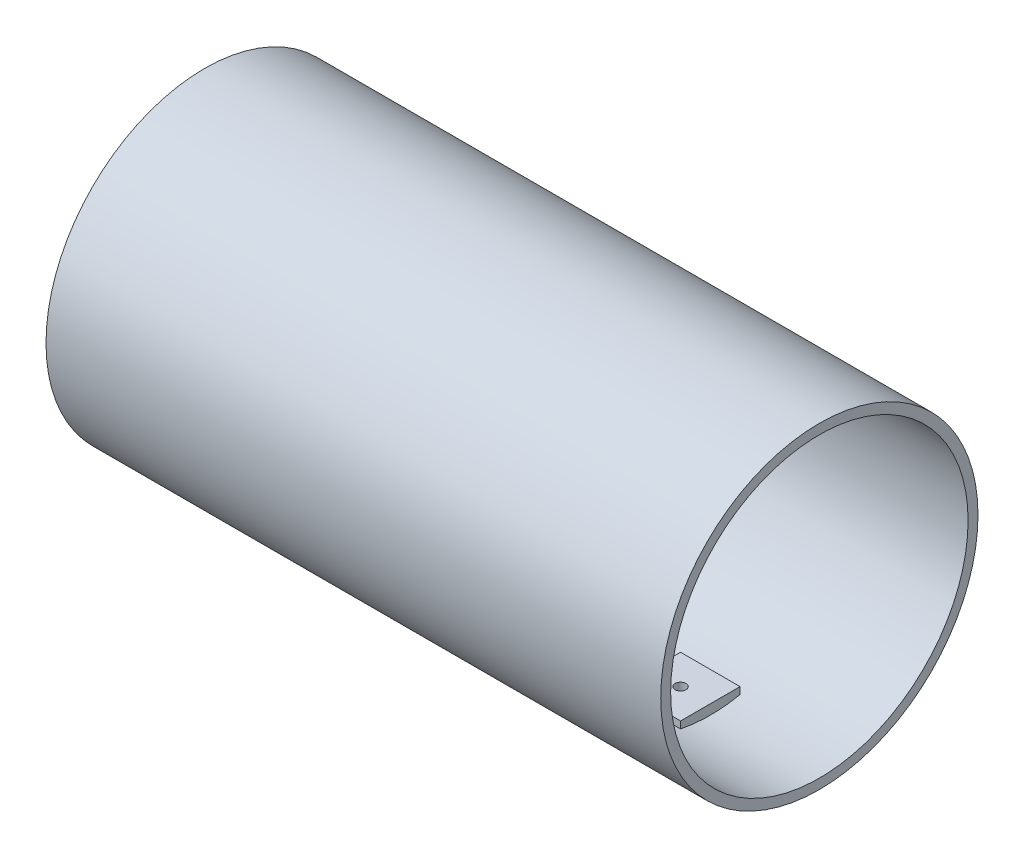
ISO-10303-21;
HEADER;
FILE_DESCRIPTION(('STEP AP214'),'2;1');
FILE_NAME('part.step','',(''),(''),'','','');
FILE_SCHEMA(('AUTOMOTIVE_DESIGN { 1 0 10303 214 1 1 1 1 }'));
ENDSEC;
DATA;
#1=APPLICATION_CONTEXT('core data for automotive mechanical design processes');
#2=APPLICATION_PROTOCOL_DEFINITION('international standard','automotive_design',2000,#1);
#3=PRODUCT_CONTEXT('',#1,'mechanical');
#4=PRODUCT('Part','Part','',(#3));
#5=PRODUCT_RELATED_PRODUCT_CATEGORY('part','',(#4));
#6=PRODUCT_DEFINITION_FORMATION('','',#4);
#7=PRODUCT_DEFINITION_CONTEXT('part definition',#1,'design');
#8=PRODUCT_DEFINITION('design','',#6,#7);
#9=PRODUCT_DEFINITION_SHAPE('','',#8);
#10=(LENGTH_UNIT() NAMED_UNIT(*) SI_UNIT(.MILLI.,.METRE.));
#11=(NAMED_UNIT(*) PLANE_ANGLE_UNIT() SI_UNIT($,.RADIAN.));
#12=(NAMED_UNIT(*) SI_UNIT($,.STERADIAN.) SOLID_ANGLE_UNIT());
#13=UNCERTAINTY_MEASURE_WITH_UNIT(LENGTH_MEASURE(1.E-05),#10,'distance_accuracy_value','');
#14=(GEOMETRIC_REPRESENTATION_CONTEXT(3) GLOBAL_UNCERTAINTY_ASSIGNED_CONTEXT((#13)) GLOBAL_UNIT_ASSIGNED_CONTEXT((#10,
#11,#12)) REPRESENTATION_CONTEXT('',''));
#15=CARTESIAN_POINT('',(0.,0.,0.));
#16=DIRECTION('',(0.,0.,1.));
#17=DIRECTION('',(1.,0.,0.));
#18=AXIS2_PLACEMENT_3D('',#15,#16,#17);
#19=CARTESIAN_POINT('',(0.,0.,0.));
#20=DIRECTION('',(-1.,0.,0.));
#21=DIRECTION('',(0.,0.,1.));
#22=AXIS2_PLACEMENT_3D('',#19,#20,#21);
#23=CYLINDRICAL_SURFACE('',#22,75.);
#24=DIRECTION('',(-1.,0.,0.));
#25=VECTOR('',#24,1.);
#26=CARTESIAN_POINT('',(0.,-73.4846922834953,15.));
#27=LINE('',#26,#25);
#28=CARTESIAN_POINT('',(255.,-73.4846922834953,15.));
#29=VERTEX_POINT('',#28);
#30=CARTESIAN_POINT('',(225.,-73.4846922834953,15.));
#31=VERTEX_POINT('',#30);
#32=EDGE_CURVE('E45',#29,#31,#27,.T.);
#33=ORIENTED_EDGE('',*,*,#32,.T.);
#34=CARTESIAN_POINT('',(225.,0.,0.));
#35=DIRECTION('',(-1.,0.,0.));
#36=DIRECTION('',(0.,0.,1.));
#37=AXIS2_PLACEMENT_3D('',#34,#35,#36);
#38=CIRCLE('',#37,75.);
#39=CARTESIAN_POINT('',(225.,-73.4846922834953,-15.));
#40=VERTEX_POINT('',#39);
#41=EDGE_CURVE('E52',#31,#40,#38,.F.);
#42=ORIENTED_EDGE('',*,*,#41,.T.);
#43=DIRECTION('',(-1.,0.,0.));
#44=VECTOR('',#43,1.);
#45=CARTESIAN_POINT('',(0.,-73.4846922834953,-15.));
#46=LINE('',#45,#44);
#47=CARTESIAN_POINT('',(255.,-73.4846922834953,-15.));
#48=VERTEX_POINT('',#47);
#49=EDGE_CURVE('E575',#40,#48,#46,.F.);
#50=ORIENTED_EDGE('',*,*,#49,.T.);
#51=CARTESIAN_POINT('',(255.,0.,0.));
#52=DIRECTION('',(1.,0.,0.));
#53=DIRECTION('',(0.,0.,-1.));
#54=AXIS2_PLACEMENT_3D('',#51,#52,#53);
#55=CIRCLE('',#54,75.);
#56=EDGE_CURVE('E158',#48,#29,#55,.F.);
#57=ORIENTED_EDGE('',*,*,#56,.T.);
#58=EDGE_LOOP('',(#33,#42,#50,#57));
#59=FACE_BOUND('',#58,.T.);
#60=CARTESIAN_POINT('',(0.,0.,0.));
#61=DIRECTION('',(-1.,0.,0.));
#62=DIRECTION('',(0.,0.,1.));
#63=AXIS2_PLACEMENT_3D('',#60,#61,#62);
#64=CIRCLE('',#63,75.);
#65=CARTESIAN_POINT('',(0.,0.,75.));
#66=VERTEX_POINT('',#65);
#67=EDGE_CURVE('E270',#66,#66,#64,.T.);
#68=ORIENTED_EDGE('',*,*,#67,.T.);
#69=EDGE_LOOP('',(#68));
#70=FACE_BOUND('',#69,.T.);
#71=CARTESIAN_POINT('',(310.,0.,0.));
#72=DIRECTION('',(-1.,0.,0.));
#73=DIRECTION('',(0.,0.,1.));
#74=AXIS2_PLACEMENT_3D('',#71,#72,#73);
#75=CIRCLE('',#74,75.);
#76=CARTESIAN_POINT('',(310.,0.,75.));
#77=VERTEX_POINT('',#76);
#78=EDGE_CURVE('E267',#77,#77,#75,.T.);
#79=ORIENTED_EDGE('',*,*,#78,.F.);
#80=EDGE_LOOP('',(#79));
#81=FACE_BOUND('',#80,.T.);
#82=DIRECTION('',(-1.,0.,0.));
#83=VECTOR('',#82,1.);
#84=CARTESIAN_POINT('',(0.,-2.5,74.9583217528247));
#85=LINE('',#84,#83);
#86=CARTESIAN_POINT('',(255.,-2.5,74.9583217528247));
#87=VERTEX_POINT('',#86);
#88=CARTESIAN_POINT('',(215.,-2.5,74.9583217528247));
#89=VERTEX_POINT('',#88);
#90=EDGE_CURVE('E280',#87,#89,#85,.T.);
#91=ORIENTED_EDGE('',*,*,#90,.F.);
#92=CARTESIAN_POINT('',(255.,0.,0.));
#93=DIRECTION('',(-1.,0.,0.));
#94=DIRECTION('',(0.,0.,1.));
#95=AXIS2_PLACEMENT_3D('',#92,#93,#94);
#96=CIRCLE('',#95,75.);
#97=CARTESIAN_POINT('',(255.,2.5,74.9583217528247));
#98=VERTEX_POINT('',#97);
#99=EDGE_CURVE('E278',#98,#87,#96,.F.);
#100=ORIENTED_EDGE('',*,*,#99,.F.);
#101=DIRECTION('',(-1.,0.,0.));
#102=VECTOR('',#101,1.);
#103=CARTESIAN_POINT('',(0.,2.5,74.9583217528247));
#104=LINE('',#103,#102);
#105=CARTESIAN_POINT('',(215.,2.5,74.9583217528247));
#106=VERTEX_POINT('',#105);
#107=EDGE_CURVE('E273',#98,#106,#104,.T.);
#108=ORIENTED_EDGE('',*,*,#107,.T.);
#109=CARTESIAN_POINT('',(215.,0.,0.));
#110=DIRECTION('',(-1.,0.,0.));
#111=DIRECTION('',(0.,0.,1.));
#112=AXIS2_PLACEMENT_3D('',#109,#110,#111);
#113=CIRCLE('',#112,75.);
#114=EDGE_CURVE('E276',#106,#89,#113,.F.);
#115=ORIENTED_EDGE('',*,*,#114,.T.);
#116=EDGE_LOOP('',(#91,#100,#108,#115));
#117=FACE_BOUND('',#116,.T.);
#118=CARTESIAN_POINT('',(85.,0.,0.));
#119=DIRECTION('',(-1.,0.,0.));
#120=DIRECTION('',(0.,0.,1.));
#121=AXIS2_PLACEMENT_3D('',#118,#119,#120);
#122=CIRCLE('',#121,75.);
#123=CARTESIAN_POINT('',(85.,-73.4846922834953,15.));
#124=VERTEX_POINT('',#123);
#125=CARTESIAN_POINT('',(85.,-73.4846922834953,-15.));
#126=VERTEX_POINT('',#125);
#127=EDGE_CURVE('E60',#124,#126,#122,.F.);
#128=ORIENTED_EDGE('',*,*,#127,.F.);
#129=DIRECTION('',(-1.,0.,0.));
#130=VECTOR('',#129,1.);
#131=CARTESIAN_POINT('',(0.,-73.4846922834953,15.));
#132=LINE('',#131,#130);
#133=CARTESIAN_POINT('',(55.,-73.4846922834953,15.));
#134=VERTEX_POINT('',#133);
#135=EDGE_CURVE('E290',#134,#124,#132,.F.);
#136=ORIENTED_EDGE('',*,*,#135,.F.);
#137=CARTESIAN_POINT('',(55.,0.,0.));
#138=DIRECTION('',(1.,0.,0.));
#139=DIRECTION('',(0.,0.,-1.));
#140=AXIS2_PLACEMENT_3D('',#137,#138,#139);
#141=CIRCLE('',#140,75.);
#142=CARTESIAN_POINT('',(55.,-73.4846922834953,-15.));
#143=VERTEX_POINT('',#142);
#144=EDGE_CURVE('E284',#143,#134,#141,.F.);
#145=ORIENTED_EDGE('',*,*,#144,.F.);
#146=DIRECTION('',(-1.,0.,0.));
#147=VECTOR('',#146,1.);
#148=CARTESIAN_POINT('',(0.,-73.4846922834953,-15.));
#149=LINE('',#148,#147);
#150=EDGE_CURVE('E287',#126,#143,#149,.T.);
#151=ORIENTED_EDGE('',*,*,#150,.F.);
#152=EDGE_LOOP('',(#128,#136,#145,#151));
#153=FACE_BOUND('',#152,.T.);
#154=ADVANCED_FACE('F33',(#59,#70,#81,#117,#153),#23,.F.);
#155=CARTESIAN_POINT('',(0.,80.,0.));
#156=DIRECTION('',(1.,0.,0.));
#157=DIRECTION('',(0.,0.,-1.));
#158=AXIS2_PLACEMENT_3D('',#155,#156,#157);
#159=PLANE('',#158);
#160=ORIENTED_EDGE('',*,*,#67,.F.);
#161=EDGE_LOOP('',(#160));
#162=FACE_BOUND('',#161,.T.);
#163=CARTESIAN_POINT('',(0.,0.,0.));
#164=DIRECTION('',(-1.,0.,0.));
#165=DIRECTION('',(0.,0.,1.));
#166=AXIS2_PLACEMENT_3D('',#163,#164,#165);
#167=CIRCLE('',#166,80.);
#168=CARTESIAN_POINT('',(0.,0.,80.));
#169=VERTEX_POINT('',#168);
#170=EDGE_CURVE('E252',#169,#169,#167,.T.);
#171=ORIENTED_EDGE('',*,*,#170,.T.);
#172=EDGE_LOOP('',(#171));
#173=FACE_BOUND('',#172,.T.);
#174=ADVANCED_FACE('F35',(#162,#173),#159,.F.);
#175=CARTESIAN_POINT('',(310.,80.,0.));
#176=DIRECTION('',(-1.,0.,0.));
#177=DIRECTION('',(0.,0.,1.));
#178=AXIS2_PLACEMENT_3D('',#175,#176,#177);
#179=PLANE('',#178);
#180=CARTESIAN_POINT('',(310.,0.,0.));
#181=DIRECTION('',(-1.,0.,0.));
#182=DIRECTION('',(0.,0.,1.));
#183=AXIS2_PLACEMENT_3D('',#180,#181,#182);
#184=CIRCLE('',#183,80.);
#185=CARTESIAN_POINT('',(310.,0.,80.));
#186=VERTEX_POINT('',#185);
#187=EDGE_CURVE('E264',#186,#186,#184,.T.);
#188=ORIENTED_EDGE('',*,*,#187,.F.);
#189=EDGE_LOOP('',(#188));
#190=FACE_BOUND('',#189,.T.);
#191=ORIENTED_EDGE('',*,*,#78,.T.);
#192=EDGE_LOOP('',(#191));
#193=FACE_BOUND('',#192,.T.);
#194=ADVANCED_FACE('F373',(#190,#193),#179,.F.);
#195=CARTESIAN_POINT('',(0.,0.,0.));
#196=DIRECTION('',(-1.,0.,0.));
#197=DIRECTION('',(0.,0.,1.));
#198=AXIS2_PLACEMENT_3D('',#195,#196,#197);
#199=CYLINDRICAL_SURFACE('',#198,80.);
#200=CARTESIAN_POINT('',(237.25,-80.,0.));
#201=CARTESIAN_POINT('',(237.250006832831,-79.9999993639771,0.154419769765298));
#202=CARTESIAN_POINT('',(237.26305028018,-79.9995481025508,0.308950346852865));
#203=CARTESIAN_POINT('',(237.314900297823,-79.9977913128397,0.613752292364118));
#204=CARTESIAN_POINT('',(237.353737568554,-79.9964847666006,0.764018362566593));
#205=CARTESIAN_POINT('',(237.456065308594,-79.9931653553996,1.05583158790571));
#206=CARTESIAN_POINT('',(237.519543628897,-79.991152838556,1.19738299992575));
#207=CARTESIAN_POINT('',(237.669333902542,-79.9866484321069,1.46778127117689));
#208=CARTESIAN_POINT('',(237.755640314314,-79.9841566588819,1.59663120331428));
#209=CARTESIAN_POINT('',(237.948691972365,-79.9789727213835,1.8380796871133));
#210=CARTESIAN_POINT('',(238.055446873629,-79.9762804628171,1.9506705176347));
#211=CARTESIAN_POINT('',(238.286347500798,-79.9709998155008,2.15633953848887));
#212=CARTESIAN_POINT('',(238.410493922069,-79.9684114309093,2.24941694824461));
#213=CARTESIAN_POINT('',(238.672686025731,-79.963629884232,2.41343205040707));
#214=CARTESIAN_POINT('',(238.810734889729,-79.9614368129363,2.48436465962742));
#215=CARTESIAN_POINT('',(239.096790595677,-79.9576941552555,2.60204373980089));
#216=CARTESIAN_POINT('',(239.244797391425,-79.9561445658852,2.64879032295852));
#217=CARTESIAN_POINT('',(239.546505154066,-79.9538643438856,2.71675256357908));
#218=CARTESIAN_POINT('',(239.700203828551,-79.9531333851795,2.73797838671545));
#219=CARTESIAN_POINT('',(240.008984387582,-79.9525718649214,2.75432791449955));
#220=CARTESIAN_POINT('',(240.164066265655,-79.9527412991576,2.74945174124804));
#221=CARTESIAN_POINT('',(240.471142049847,-79.9539611545101,2.71374424645739));
#222=CARTESIAN_POINT('',(240.623137234871,-79.9550112028071,2.68292390869558));
#223=CARTESIAN_POINT('',(240.919795044953,-79.9578733314094,2.59621995938346));
#224=CARTESIAN_POINT('',(241.064457651248,-79.9596854136646,2.54033628370063));
#225=CARTESIAN_POINT('',(241.342379229752,-79.9638677727283,2.40507939441804));
#226=CARTESIAN_POINT('',(241.47563575214,-79.9662381690444,2.32570115084649));
#227=CARTESIAN_POINT('',(241.726935641931,-79.9712698256646,2.14571210067467));
#228=CARTESIAN_POINT('',(241.844978961781,-79.9739310868777,2.04510122770878));
#229=CARTESIAN_POINT('',(242.062565600052,-79.9792461384265,1.82544078906123));
#230=CARTESIAN_POINT('',(242.162099307015,-79.98189992418,1.7063817023012));
#231=CARTESIAN_POINT('',(242.339767306182,-79.9868995431376,1.4532380528239));
#232=CARTESIAN_POINT('',(242.417901594657,-79.9892453762882,1.31915348748807));
#233=CARTESIAN_POINT('',(242.550551759969,-79.9933647059845,1.03975966540763));
#234=CARTESIAN_POINT('',(242.605067328673,-79.9951381950634,0.894450262250646));
#235=CARTESIAN_POINT('',(242.688926391235,-79.9979128087513,0.596733996510435));
#236=CARTESIAN_POINT('',(242.718269974714,-79.9989139361103,0.444327159197951));
#237=CARTESIAN_POINT('',(242.750940318366,-80.000030626771,0.136825812283335));
#238=CARTESIAN_POINT('',(242.754280376968,-80.0001466427258,-0.0182672828640421));
#239=CARTESIAN_POINT('',(242.734883522674,-79.9994812328329,-0.326811958560618));
#240=CARTESIAN_POINT('',(242.712146649841,-79.998699808364,-0.480263541631334));
#241=CARTESIAN_POINT('',(242.641252356512,-79.9963278672327,-0.78113214572113));
#242=CARTESIAN_POINT('',(242.593100980138,-79.9947375429475,-0.928550592572845));
#243=CARTESIAN_POINT('',(242.472750654457,-79.9909269798131,-1.21321204980163));
#244=CARTESIAN_POINT('',(242.400551640876,-79.9887067392802,-1.35045503298111));
#245=CARTESIAN_POINT('',(242.234121299431,-79.9838852672376,-1.61093091625578));
#246=CARTESIAN_POINT('',(242.139881027694,-79.9812838812277,-1.7341580987875));
#247=CARTESIAN_POINT('',(241.932056428143,-79.9759937733403,-1.9630469747456));
#248=CARTESIAN_POINT('',(241.818472037818,-79.9733050511805,-2.06870861140636));
#249=CARTESIAN_POINT('',(241.575126420795,-79.9681420803225,-2.25951151998106));
#250=CARTESIAN_POINT('',(241.445358460928,-79.9656679216239,-2.34464420732982));
#251=CARTESIAN_POINT('',(241.173363624525,-79.9612144508798,-2.4919139324181));
#252=CARTESIAN_POINT('',(241.031136780691,-79.9592351375353,-2.55405103051554));
#253=CARTESIAN_POINT('',(240.738293704314,-79.9559951697504,-2.65355069772363));
#254=CARTESIAN_POINT('',(240.58767935593,-79.9547343546165,-2.69091880676771));
#255=CARTESIAN_POINT('',(240.282310042446,-79.9530730895195,-2.73983790355504));
#256=CARTESIAN_POINT('',(240.127555084476,-79.952672638075,-2.7513889357519));
#257=CARTESIAN_POINT('',(239.818383247661,-79.9527773086307,-2.74834536167993));
#258=CARTESIAN_POINT('',(239.663966235298,-79.953281962075,-2.73376428351609));
#259=CARTESIAN_POINT('',(239.359773396193,-79.9551389679644,-2.67889824918251));
#260=CARTESIAN_POINT('',(239.209997578601,-79.9564913220804,-2.63861324234431));
#261=CARTESIAN_POINT('',(238.91933431133,-79.9598912007163,-2.53348505737732));
#262=CARTESIAN_POINT('',(238.778447000398,-79.9619387360843,-2.4686414960121));
#263=CARTESIAN_POINT('',(238.509560633062,-79.9664980806314,-2.31624067640066));
#264=CARTESIAN_POINT('',(238.381561123274,-79.9690098734694,-2.22868421756658));
#265=CARTESIAN_POINT('',(238.142019621717,-79.9742159624849,-2.03329996453065));
#266=CARTESIAN_POINT('',(238.030484412657,-79.976910333215,-1.92546385719918));
#267=CARTESIAN_POINT('',(237.827069442427,-79.9821777488634,-1.6925659845831));
#268=CARTESIAN_POINT('',(237.735194549382,-79.9847507636099,-1.56749996554328));
#269=CARTESIAN_POINT('',(237.573687834392,-79.9894864886905,-1.30363492112652));
#270=CARTESIAN_POINT('',(237.504071677385,-79.9916489096299,-1.16482631376728));
#271=CARTESIAN_POINT('',(237.389213752581,-79.9953147274509,-0.877590488912763));
#272=CARTESIAN_POINT('',(237.343942967503,-79.9968189084893,-0.729174959480033));
#273=CARTESIAN_POINT('',(237.291036506192,-79.9985974732849,-0.483187152166956));
#274=CARTESIAN_POINT('',(237.275667229201,-79.9991211335875,-0.387210967586064));
#275=CARTESIAN_POINT('',(237.255146829669,-79.9998225968604,-0.194171128239601));
#276=CARTESIAN_POINT('',(237.249995703147,-80.0000003999655,-0.0971074738977777));
#277=CARTESIAN_POINT('',(237.25,-80.,0.));
#278=B_SPLINE_CURVE_WITH_KNOTS('',3,(#200,#201,#202,#203,#204,#205,#206,#207,#208,#209,#210,
#211,#212,#213,#214,#215,#216,#217,#218,#219,#220,#221,#222,#223,#224,#225,#226,#227,#228,#229,
#230,#231,#232,#233,#234,#235,#236,#237,#238,#239,#240,#241,#242,#243,#244,#245,#246,#247,#248,
#249,#250,#251,#252,#253,#254,#255,#256,#257,#258,#259,#260,#261,#262,#263,#264,#265,#266,#267,
#268,#269,#270,#271,#272,#273,#274,#275,#276,#277),.UNSPECIFIED.,.T.,.F.,(4,2,2,2,2,2,2,2,2,2,2,
2,2,2,2,2,2,2,2,2,2,2,2,2,2,2,2,2,2,2,2,2,2,2,2,2,2,2,4),(0.,0.462904850286608,
0.926361650959832,1.38959023886444,1.85270648004005,2.31604192821266,2.77939590722257,
3.24285616787652,3.7063142784132,4.16958771865396,4.63285899178132,5.09593423196878,
5.55901065708816,6.02218629442757,6.48536337951002,6.94878031028658,7.41219732182516,
7.87562037901408,8.33904178629004,8.8022261802704,9.2654098626537,9.72848343948148,
10.1915582539951,10.6548213014154,11.1180858459084,11.5815437785184,12.0450004946535,
12.5083535171541,12.9717057418213,13.4348181669874,13.8979315050596,14.3610520703169,
14.8241563376102,15.2874508582423,15.750859963614,16.2145944862554,16.6777750511449,
16.968874683336,17.2599742021002),.UNSPECIFIED.);
#279=CARTESIAN_POINT('',(237.25,-80.,0.));
#280=VERTEX_POINT('',#279);
#281=EDGE_CURVE('E11',#280,#280,#278,.T.);
#282=ORIENTED_EDGE('',*,*,#281,.T.);
#283=EDGE_LOOP('',(#282));
#284=FACE_BOUND('',#283,.T.);
#285=CARTESIAN_POINT('',(67.25,-80.,0.));
#286=CARTESIAN_POINT('',(67.2500068328314,-79.9999993639771,0.154419769765297));
#287=CARTESIAN_POINT('',(67.2630502801799,-79.9995481025508,0.308950346852862));
#288=CARTESIAN_POINT('',(67.3149002978225,-79.9977913128397,0.613752292364115));
#289=CARTESIAN_POINT('',(67.3537375685541,-79.9964847666006,0.764018362566591));
#290=CARTESIAN_POINT('',(67.4560653085939,-79.9931653553996,1.0558315879057));
#291=CARTESIAN_POINT('',(67.5195436288971,-79.991152838556,1.19738299992573));
#292=CARTESIAN_POINT('',(67.669333902542,-79.9866484321069,1.46778127117688));
#293=CARTESIAN_POINT('',(67.7556403143138,-79.9841566588819,1.59663120331428));
#294=CARTESIAN_POINT('',(67.9486919723645,-79.9789727213835,1.83807968711329));
#295=CARTESIAN_POINT('',(68.0554468736289,-79.9762804628171,1.95067051763468));
#296=CARTESIAN_POINT('',(68.2863475007983,-79.9709998155008,2.15633953848885));
#297=CARTESIAN_POINT('',(68.4104939220687,-79.9684114309093,2.2494169482446));
#298=CARTESIAN_POINT('',(68.6726860257311,-79.963629884232,2.41343205040706));
#299=CARTESIAN_POINT('',(68.8107348897291,-79.9614368129363,2.48436465962741));
#300=CARTESIAN_POINT('',(69.0967905956765,-79.9576941552555,2.60204373980088));
#301=CARTESIAN_POINT('',(69.244797391425,-79.9561445658852,2.64879032295851));
#302=CARTESIAN_POINT('',(69.5465051540664,-79.9538643438856,2.71675256357908));
#303=CARTESIAN_POINT('',(69.700203828551,-79.9531333851795,2.73797838671544));
#304=CARTESIAN_POINT('',(70.0089843875823,-79.9525718649214,2.75432791449955));
#305=CARTESIAN_POINT('',(70.1640662656553,-79.9527412991576,2.74945174124804));
#306=CARTESIAN_POINT('',(70.4711420498472,-79.9539611545101,2.71374424645739));
#307=CARTESIAN_POINT('',(70.6231372348711,-79.9550112028071,2.68292390869559));
#308=CARTESIAN_POINT('',(70.9197950449533,-79.9578733314094,2.59621995938347));
#309=CARTESIAN_POINT('',(71.0644576512479,-79.9596854136646,2.54033628370065));
#310=CARTESIAN_POINT('',(71.3423792297522,-79.9638677727283,2.40507939441805));
#311=CARTESIAN_POINT('',(71.47563575214,-79.9662381690444,2.3257011508465));
#312=CARTESIAN_POINT('',(71.726935641931,-79.9712698256646,2.14571210067468));
#313=CARTESIAN_POINT('',(71.8449789617813,-79.9739310868777,2.0451012277088));
#314=CARTESIAN_POINT('',(72.0625656000517,-79.9792461384265,1.82544078906124));
#315=CARTESIAN_POINT('',(72.1620993070151,-79.98189992418,1.70638170230121));
#316=CARTESIAN_POINT('',(72.3397673061825,-79.9868995431376,1.45323805282391));
#317=CARTESIAN_POINT('',(72.4179015946569,-79.9892453762882,1.31915348748808));
#318=CARTESIAN_POINT('',(72.5505517599693,-79.9933647059845,1.03975966540764));
#319=CARTESIAN_POINT('',(72.6050673286725,-79.9951381950634,0.894450262250649));
#320=CARTESIAN_POINT('',(72.6889263912354,-79.9979128087513,0.596733996510439));
#321=CARTESIAN_POINT('',(72.7182699747138,-79.9989139361103,0.444327159197959));
#322=CARTESIAN_POINT('',(72.7509403183664,-80.000030626771,0.136825812283347));
#323=CARTESIAN_POINT('',(72.7542803769683,-80.0001466427258,-0.0182672828640308));
#324=CARTESIAN_POINT('',(72.7348835226741,-79.9994812328329,-0.326811958560607));
#325=CARTESIAN_POINT('',(72.7121466498405,-79.998699808364,-0.480263541631324));
#326=CARTESIAN_POINT('',(72.6412523565116,-79.9963278672327,-0.781132145721123));
#327=CARTESIAN_POINT('',(72.5931009801382,-79.9947375429475,-0.928550592572842));
#328=CARTESIAN_POINT('',(72.4727506544569,-79.9909269798131,-1.21321204980162));
#329=CARTESIAN_POINT('',(72.4005516408758,-79.9887067392802,-1.35045503298111));
#330=CARTESIAN_POINT('',(72.2341212994307,-79.9838852672376,-1.61093091625578));
#331=CARTESIAN_POINT('',(72.1398810276935,-79.9812838812277,-1.73415809878749));
#332=CARTESIAN_POINT('',(71.9320564281427,-79.9759937733403,-1.96304697474559));
#333=CARTESIAN_POINT('',(71.818472037818,-79.9733050511805,-2.06870861140636));
#334=CARTESIAN_POINT('',(71.5751264207952,-79.9681420803225,-2.25951151998106));
#335=CARTESIAN_POINT('',(71.4453584609282,-79.9656679216239,-2.34464420732982));
#336=CARTESIAN_POINT('',(71.1733636245247,-79.9612144508798,-2.49191393241809));
#337=CARTESIAN_POINT('',(71.031136780691,-79.9592351375353,-2.55405103051553));
#338=CARTESIAN_POINT('',(70.7382937043142,-79.9559951697504,-2.65355069772363));
#339=CARTESIAN_POINT('',(70.5876793559295,-79.9547343546165,-2.69091880676771));
#340=CARTESIAN_POINT('',(70.2823100424455,-79.9530730895195,-2.73983790355504));
#341=CARTESIAN_POINT('',(70.1275550844762,-79.952672638075,-2.7513889357519));
#342=CARTESIAN_POINT('',(69.8183832476612,-79.9527773086307,-2.74834536167994));
#343=CARTESIAN_POINT('',(69.6639662352981,-79.953281962075,-2.73376428351609));
#344=CARTESIAN_POINT('',(69.3597733961931,-79.9551389679644,-2.67889824918252));
#345=CARTESIAN_POINT('',(69.2099975786006,-79.9564913220804,-2.63861324234431));
#346=CARTESIAN_POINT('',(68.9193343113303,-79.9598912007163,-2.53348505737733));
#347=CARTESIAN_POINT('',(68.7784470003977,-79.9619387360843,-2.46864149601211));
#348=CARTESIAN_POINT('',(68.5095606330618,-79.9664980806314,-2.31624067640066));
#349=CARTESIAN_POINT('',(68.3815611232744,-79.9690098734694,-2.22868421756658));
#350=CARTESIAN_POINT('',(68.1420196217167,-79.9742159624849,-2.03329996453066));
#351=CARTESIAN_POINT('',(68.030484412657,-79.976910333215,-1.92546385719919));
#352=CARTESIAN_POINT('',(67.8270694424274,-79.9821777488634,-1.69256598458311));
#353=CARTESIAN_POINT('',(67.7351945493816,-79.9847507636099,-1.56749996554328));
#354=CARTESIAN_POINT('',(67.5736878343921,-79.9894864886905,-1.30363492112651));
#355=CARTESIAN_POINT('',(67.5040716773851,-79.9916489096299,-1.16482631376728));
#356=CARTESIAN_POINT('',(67.3892137525805,-79.9953147274509,-0.877590488912773));
#357=CARTESIAN_POINT('',(67.3439429675031,-79.9968189084893,-0.729174959480048));
#358=CARTESIAN_POINT('',(67.2910365061923,-79.9985974732849,-0.483187152166974));
#359=CARTESIAN_POINT('',(67.2756672292009,-79.9991211335875,-0.387210967586079));
#360=CARTESIAN_POINT('',(67.2551468296692,-79.9998225968604,-0.19417112823961));
#361=CARTESIAN_POINT('',(67.2499957031473,-80.0000003999655,-0.0971074738977818));
#362=CARTESIAN_POINT('',(67.25,-80.,0.));
#363=B_SPLINE_CURVE_WITH_KNOTS('',3,(#285,#286,#287,#288,#289,#290,#291,#292,#293,#294,#295,
#296,#297,#298,#299,#300,#301,#302,#303,#304,#305,#306,#307,#308,#309,#310,#311,#312,#313,#314,
#315,#316,#317,#318,#319,#320,#321,#322,#323,#324,#325,#326,#327,#328,#329,#330,#331,#332,#333,
#334,#335,#336,#337,#338,#339,#340,#341,#342,#343,#344,#345,#346,#347,#348,#349,#350,#351,#352,
#353,#354,#355,#356,#357,#358,#359,#360,#361,#362),.UNSPECIFIED.,.T.,.F.,(4,2,2,2,2,2,2,2,2,2,2,
2,2,2,2,2,2,2,2,2,2,2,2,2,2,2,2,2,2,2,2,2,2,2,2,2,2,2,4),(0.,0.462904850286602,
0.926361650959827,1.38959023886443,1.85270648004004,2.31604192821263,2.77939590722255,
3.24285616787651,3.70631427841317,4.16958771865396,4.63285899178131,5.09593423196875,
5.55901065708813,6.02218629442754,6.48536337951001,6.94878031028658,7.41219732182516,
7.87562037901408,8.33904178629004,8.8022261802704,9.2654098626537,9.72848343948148,
10.1915582539951,10.6548213014154,11.1180858459084,11.5815437785184,12.0450004946535,
12.5083535171541,12.9717057418213,13.4348181669874,13.8979315050596,14.3610520703169,
14.8241563376102,15.2874508582423,15.750859963614,16.2145944862554,16.6777750511449,
16.968874683336,17.2599742021002),.UNSPECIFIED.);
#364=CARTESIAN_POINT('',(67.25,-80.,0.));
#365=VERTEX_POINT('',#364);
#366=EDGE_CURVE('E292',#365,#365,#363,.T.);
#367=ORIENTED_EDGE('',*,*,#366,.T.);
#368=EDGE_LOOP('',(#367));
#369=FACE_BOUND('',#368,.T.);
#370=ORIENTED_EDGE('',*,*,#170,.F.);
#371=EDGE_LOOP('',(#370));
#372=FACE_BOUND('',#371,.T.);
#373=ORIENTED_EDGE('',*,*,#187,.T.);
#374=EDGE_LOOP('',(#373));
#375=FACE_BOUND('',#374,.T.);
#376=ADVANCED_FACE('F299',(#284,#369,#372,#375),#199,.T.);
#377=CARTESIAN_POINT('',(255.,-2.5,55.));
#378=DIRECTION('',(-1.,0.,0.));
#379=DIRECTION('',(0.,0.,1.));
#380=AXIS2_PLACEMENT_3D('',#377,#378,#379);
#381=PLANE('',#380);
#382=ORIENTED_EDGE('',*,*,#99,.T.);
#383=DIRECTION('',(0.,0.,1.));
#384=VECTOR('',#383,1.);
#385=CARTESIAN_POINT('',(255.,-2.5,55.));
#386=LINE('',#385,#384);
#387=CARTESIAN_POINT('',(255.,-2.5,55.));
#388=VERTEX_POINT('',#387);
#389=EDGE_CURVE('E239',#388,#87,#386,.T.);
#390=ORIENTED_EDGE('',*,*,#389,.F.);
#391=DIRECTION('',(0.,1.,0.));
#392=VECTOR('',#391,1.);
#393=CARTESIAN_POINT('',(255.,-2.5,55.));
#394=LINE('',#393,#392);
#395=CARTESIAN_POINT('',(255.,2.5,55.));
#396=VERTEX_POINT('',#395);
#397=EDGE_CURVE('E257',#388,#396,#394,.T.);
#398=ORIENTED_EDGE('',*,*,#397,.T.);
#399=DIRECTION('',(0.,0.,1.));
#400=VECTOR('',#399,1.);
#401=CARTESIAN_POINT('',(255.,2.5,55.));
#402=LINE('',#401,#400);
#403=EDGE_CURVE('E218',#396,#98,#402,.T.);
#404=ORIENTED_EDGE('',*,*,#403,.T.);
#405=EDGE_LOOP('',(#382,#390,#398,#404));
#406=FACE_BOUND('',#405,.T.);
#407=ADVANCED_FACE('F353',(#406),#381,.F.);
#408=CARTESIAN_POINT('',(215.,-2.5,55.));
#409=DIRECTION('',(-1.,0.,0.));
#410=DIRECTION('',(0.,0.,1.));
#411=AXIS2_PLACEMENT_3D('',#408,#409,#410);
#412=PLANE('',#411);
#413=DIRECTION('',(0.,0.,1.));
#414=VECTOR('',#413,1.);
#415=CARTESIAN_POINT('',(215.,-2.5,55.));
#416=LINE('',#415,#414);
#417=CARTESIAN_POINT('',(215.,-2.5,55.));
#418=VERTEX_POINT('',#417);
#419=EDGE_CURVE('E236',#418,#89,#416,.T.);
#420=ORIENTED_EDGE('',*,*,#419,.T.);
#421=ORIENTED_EDGE('',*,*,#114,.F.);
#422=DIRECTION('',(0.,0.,1.));
#423=VECTOR('',#422,1.);
#424=CARTESIAN_POINT('',(215.,2.5,55.));
#425=LINE('',#424,#423);
#426=CARTESIAN_POINT('',(215.,2.5,55.));
#427=VERTEX_POINT('',#426);
#428=EDGE_CURVE('E216',#427,#106,#425,.T.);
#429=ORIENTED_EDGE('',*,*,#428,.F.);
#430=DIRECTION('',(0.,1.,0.));
#431=VECTOR('',#430,1.);
#432=CARTESIAN_POINT('',(215.,-2.5,55.));
#433=LINE('',#432,#431);
#434=EDGE_CURVE('E259',#418,#427,#433,.T.);
#435=ORIENTED_EDGE('',*,*,#434,.F.);
#436=EDGE_LOOP('',(#420,#421,#429,#435));
#437=FACE_BOUND('',#436,.T.);
#438=ADVANCED_FACE('F339',(#437),#412,.T.);
#439=CARTESIAN_POINT('',(0.,-2.5,0.));
#440=DIRECTION('',(0.,1.,0.));
#441=DIRECTION('',(0.,0.,1.));
#442=AXIS2_PLACEMENT_3D('',#439,#440,#441);
#443=PLANE('',#442);
#444=ORIENTED_EDGE('',*,*,#389,.T.);
#445=ORIENTED_EDGE('',*,*,#90,.T.);
#446=ORIENTED_EDGE('',*,*,#419,.F.);
#447=DIRECTION('',(1.,0.,0.));
#448=VECTOR('',#447,1.);
#449=CARTESIAN_POINT('',(195.,-2.5,55.));
#450=LINE('',#449,#448);
#451=CARTESIAN_POINT('',(195.,-2.5,55.));
#452=VERTEX_POINT('',#451);
#453=EDGE_CURVE('E233',#452,#418,#450,.T.);
#454=ORIENTED_EDGE('',*,*,#453,.F.);
#455=DIRECTION('',(0.,0.,1.));
#456=VECTOR('',#455,1.);
#457=CARTESIAN_POINT('',(195.,-2.5,45.));
#458=LINE('',#457,#456);
#459=CARTESIAN_POINT('',(195.,-2.5,45.));
#460=VERTEX_POINT('',#459);
#461=EDGE_CURVE('E230',#460,#452,#458,.T.);
#462=ORIENTED_EDGE('',*,*,#461,.F.);
#463=DIRECTION('',(1.,0.,0.));
#464=VECTOR('',#463,1.);
#465=CARTESIAN_POINT('',(195.,-2.5,45.));
#466=LINE('',#465,#464);
#467=CARTESIAN_POINT('',(275.,-2.5,45.));
#468=VERTEX_POINT('',#467);
#469=EDGE_CURVE('E247',#460,#468,#466,.T.);
#470=ORIENTED_EDGE('',*,*,#469,.T.);
#471=DIRECTION('',(0.,0.,1.));
#472=VECTOR('',#471,1.);
#473=CARTESIAN_POINT('',(275.,-2.5,45.));
#474=LINE('',#473,#472);
#475=CARTESIAN_POINT('',(275.,-2.5,55.));
#476=VERTEX_POINT('',#475);
#477=EDGE_CURVE('E245',#468,#476,#474,.T.);
#478=ORIENTED_EDGE('',*,*,#477,.T.);
#479=DIRECTION('',(1.,0.,0.));
#480=VECTOR('',#479,1.);
#481=CARTESIAN_POINT('',(255.,-2.5,55.));
#482=LINE('',#481,#480);
#483=EDGE_CURVE('E242',#388,#476,#482,.T.);
#484=ORIENTED_EDGE('',*,*,#483,.F.);
#485=EDGE_LOOP('',(#444,#445,#446,#454,#462,#470,#478,#484));
#486=FACE_BOUND('',#485,.T.);
#487=ADVANCED_FACE('F335',(#486),#443,.F.);
#488=CARTESIAN_POINT('',(0.,2.5,0.));
#489=DIRECTION('',(0.,1.,0.));
#490=DIRECTION('',(0.,0.,1.));
#491=AXIS2_PLACEMENT_3D('',#488,#489,#490);
#492=PLANE('',#491);
#493=ORIENTED_EDGE('',*,*,#107,.F.);
#494=ORIENTED_EDGE('',*,*,#403,.F.);
#495=DIRECTION('',(1.,0.,0.));
#496=VECTOR('',#495,1.);
#497=CARTESIAN_POINT('',(255.,2.5,55.));
#498=LINE('',#497,#496);
#499=CARTESIAN_POINT('',(275.,2.5,55.));
#500=VERTEX_POINT('',#499);
#501=EDGE_CURVE('E221',#396,#500,#498,.T.);
#502=ORIENTED_EDGE('',*,*,#501,.T.);
#503=DIRECTION('',(0.,0.,1.));
#504=VECTOR('',#503,1.);
#505=CARTESIAN_POINT('',(275.,2.5,45.));
#506=LINE('',#505,#504);
#507=CARTESIAN_POINT('',(275.,2.5,45.));
#508=VERTEX_POINT('',#507);
#509=EDGE_CURVE('E224',#508,#500,#506,.T.);
#510=ORIENTED_EDGE('',*,*,#509,.F.);
#511=DIRECTION('',(1.,0.,0.));
#512=VECTOR('',#511,1.);
#513=CARTESIAN_POINT('',(195.,2.5,45.));
#514=LINE('',#513,#512);
#515=CARTESIAN_POINT('',(195.,2.5,45.));
#516=VERTEX_POINT('',#515);
#517=EDGE_CURVE('E227',#516,#508,#514,.T.);
#518=ORIENTED_EDGE('',*,*,#517,.F.);
#519=DIRECTION('',(0.,0.,1.));
#520=VECTOR('',#519,1.);
#521=CARTESIAN_POINT('',(195.,2.5,45.));
#522=LINE('',#521,#520);
#523=CARTESIAN_POINT('',(195.,2.5,55.));
#524=VERTEX_POINT('',#523);
#525=EDGE_CURVE('E210',#516,#524,#522,.T.);
#526=ORIENTED_EDGE('',*,*,#525,.T.);
#527=DIRECTION('',(1.,0.,0.));
#528=VECTOR('',#527,1.);
#529=CARTESIAN_POINT('',(195.,2.5,55.));
#530=LINE('',#529,#528);
#531=EDGE_CURVE('E213',#524,#427,#530,.T.);
#532=ORIENTED_EDGE('',*,*,#531,.T.);
#533=ORIENTED_EDGE('',*,*,#428,.T.);
#534=EDGE_LOOP('',(#493,#494,#502,#510,#518,#526,#532,#533));
#535=FACE_BOUND('',#534,.T.);
#536=ADVANCED_FACE('F331',(#535),#492,.T.);
#537=CARTESIAN_POINT('',(195.,-2.5,45.));
#538=DIRECTION('',(-1.,0.,0.));
#539=DIRECTION('',(0.,0.,1.));
#540=AXIS2_PLACEMENT_3D('',#537,#538,#539);
#541=PLANE('',#540);
#542=DIRECTION('',(0.,1.,0.));
#543=VECTOR('',#542,1.);
#544=CARTESIAN_POINT('',(195.,-2.5,55.));
#545=LINE('',#544,#543);
#546=EDGE_CURVE('E249',#452,#524,#545,.T.);
#547=ORIENTED_EDGE('',*,*,#546,.T.);
#548=ORIENTED_EDGE('',*,*,#525,.F.);
#549=DIRECTION('',(0.,1.,0.));
#550=VECTOR('',#549,1.);
#551=CARTESIAN_POINT('',(195.,-2.5,45.));
#552=LINE('',#551,#550);
#553=EDGE_CURVE('E250',#460,#516,#552,.T.);
#554=ORIENTED_EDGE('',*,*,#553,.F.);
#555=ORIENTED_EDGE('',*,*,#461,.T.);
#556=EDGE_LOOP('',(#547,#548,#554,#555));
#557=FACE_BOUND('',#556,.T.);
#558=ADVANCED_FACE('F334',(#557),#541,.T.);
#559=CARTESIAN_POINT('',(195.,-2.5,45.));
#560=DIRECTION('',(0.,0.,1.));
#561=DIRECTION('',(1.,0.,0.));
#562=AXIS2_PLACEMENT_3D('',#559,#560,#561);
#563=PLANE('',#562);
#564=ORIENTED_EDGE('',*,*,#553,.T.);
#565=ORIENTED_EDGE('',*,*,#517,.T.);
#566=DIRECTION('',(0.,1.,0.));
#567=VECTOR('',#566,1.);
#568=CARTESIAN_POINT('',(275.,-2.5,45.));
#569=LINE('',#568,#567);
#570=EDGE_CURVE('E253',#468,#508,#569,.T.);
#571=ORIENTED_EDGE('',*,*,#570,.F.);
#572=ORIENTED_EDGE('',*,*,#469,.F.);
#573=EDGE_LOOP('',(#564,#565,#571,#572));
#574=FACE_BOUND('',#573,.T.);
#575=ADVANCED_FACE('F341',(#574),#563,.F.);
#576=CARTESIAN_POINT('',(275.,-2.5,45.));
#577=DIRECTION('',(-1.,0.,0.));
#578=DIRECTION('',(0.,0.,1.));
#579=AXIS2_PLACEMENT_3D('',#576,#577,#578);
#580=PLANE('',#579);
#581=ORIENTED_EDGE('',*,*,#570,.T.);
#582=ORIENTED_EDGE('',*,*,#509,.T.);
#583=DIRECTION('',(0.,1.,0.));
#584=VECTOR('',#583,1.);
#585=CARTESIAN_POINT('',(275.,-2.5,55.));
#586=LINE('',#585,#584);
#587=EDGE_CURVE('E255',#476,#500,#586,.T.);
#588=ORIENTED_EDGE('',*,*,#587,.F.);
#589=ORIENTED_EDGE('',*,*,#477,.F.);
#590=EDGE_LOOP('',(#581,#582,#588,#589));
#591=FACE_BOUND('',#590,.T.);
#592=ADVANCED_FACE('F344',(#591),#580,.F.);
#593=CARTESIAN_POINT('',(255.,-2.5,55.));
#594=DIRECTION('',(0.,0.,1.));
#595=DIRECTION('',(1.,0.,0.));
#596=AXIS2_PLACEMENT_3D('',#593,#594,#595);
#597=PLANE('',#596);
#598=ORIENTED_EDGE('',*,*,#587,.T.);
#599=ORIENTED_EDGE('',*,*,#501,.F.);
#600=ORIENTED_EDGE('',*,*,#397,.F.);
#601=ORIENTED_EDGE('',*,*,#483,.T.);
#602=EDGE_LOOP('',(#598,#599,#600,#601));
#603=FACE_BOUND('',#602,.T.);
#604=ADVANCED_FACE('F348',(#603),#597,.T.);
#605=CARTESIAN_POINT('',(195.,-2.5,55.));
#606=DIRECTION('',(0.,0.,1.));
#607=DIRECTION('',(1.,0.,0.));
#608=AXIS2_PLACEMENT_3D('',#605,#606,#607);
#609=PLANE('',#608);
#610=ORIENTED_EDGE('',*,*,#434,.T.);
#611=ORIENTED_EDGE('',*,*,#531,.F.);
#612=ORIENTED_EDGE('',*,*,#546,.F.);
#613=ORIENTED_EDGE('',*,*,#453,.T.);
#614=EDGE_LOOP('',(#610,#611,#612,#613));
#615=FACE_BOUND('',#614,.T.);
#616=ADVANCED_FACE('F329',(#615),#609,.T.);
#617=CARTESIAN_POINT('',(55.,-70.,15.));
#618=DIRECTION('',(1.,0.,0.));
#619=DIRECTION('',(0.,0.,-1.));
#620=AXIS2_PLACEMENT_3D('',#617,#618,#619);
#621=PLANE('',#620);
#622=DIRECTION('',(0.,-1.,0.));
#623=VECTOR('',#622,1.);
#624=CARTESIAN_POINT('',(55.,-70.,-15.));
#625=LINE('',#624,#623);
#626=CARTESIAN_POINT('',(55.,-70.,-15.));
#627=VERTEX_POINT('',#626);
#628=EDGE_CURVE('E198',#627,#143,#625,.T.);
#629=ORIENTED_EDGE('',*,*,#628,.T.);
#630=ORIENTED_EDGE('',*,*,#144,.T.);
#631=DIRECTION('',(0.,-1.,0.));
#632=VECTOR('',#631,1.);
#633=CARTESIAN_POINT('',(55.,-70.,15.));
#634=LINE('',#633,#632);
#635=CARTESIAN_POINT('',(55.,-70.,15.));
#636=VERTEX_POINT('',#635);
#637=EDGE_CURVE('E207',#636,#134,#634,.T.);
#638=ORIENTED_EDGE('',*,*,#637,.F.);
#639=DIRECTION('',(0.,0.,1.));
#640=VECTOR('',#639,1.);
#641=CARTESIAN_POINT('',(55.,-70.,15.));
#642=LINE('',#641,#640);
#643=EDGE_CURVE('E189',#627,#636,#642,.T.);
#644=ORIENTED_EDGE('',*,*,#643,.F.);
#645=EDGE_LOOP('',(#629,#630,#638,#644));
#646=FACE_BOUND('',#645,.T.);
#647=ADVANCED_FACE('F325',(#646),#621,.F.);
#648=CARTESIAN_POINT('',(85.,-70.,15.));
#649=DIRECTION('',(0.,0.,-1.));
#650=DIRECTION('',(-1.,0.,0.));
#651=AXIS2_PLACEMENT_3D('',#648,#649,#650);
#652=PLANE('',#651);
#653=ORIENTED_EDGE('',*,*,#637,.T.);
#654=ORIENTED_EDGE('',*,*,#135,.T.);
#655=DIRECTION('',(0.,-1.,0.));
#656=VECTOR('',#655,1.);
#657=CARTESIAN_POINT('',(85.,-70.,15.));
#658=LINE('',#657,#656);
#659=CARTESIAN_POINT('',(85.,-70.,15.));
#660=VERTEX_POINT('',#659);
#661=EDGE_CURVE('E204',#660,#124,#658,.T.);
#662=ORIENTED_EDGE('',*,*,#661,.F.);
#663=DIRECTION('',(1.,0.,0.));
#664=VECTOR('',#663,1.);
#665=CARTESIAN_POINT('',(85.,-70.,15.));
#666=LINE('',#665,#664);
#667=EDGE_CURVE('E192',#636,#660,#666,.T.);
#668=ORIENTED_EDGE('',*,*,#667,.F.);
#669=EDGE_LOOP('',(#653,#654,#662,#668));
#670=FACE_BOUND('',#669,.T.);
#671=ADVANCED_FACE('F321',(#670),#652,.F.);
#672=CARTESIAN_POINT('',(85.,-70.,15.));
#673=DIRECTION('',(-1.,0.,0.));
#674=DIRECTION('',(0.,0.,1.));
#675=AXIS2_PLACEMENT_3D('',#672,#673,#674);
#676=PLANE('',#675);
#677=ORIENTED_EDGE('',*,*,#661,.T.);
#678=ORIENTED_EDGE('',*,*,#127,.T.);
#679=DIRECTION('',(0.,-1.,0.));
#680=VECTOR('',#679,1.);
#681=CARTESIAN_POINT('',(85.,-70.,-15.));
#682=LINE('',#681,#680);
#683=CARTESIAN_POINT('',(85.,-70.,-15.));
#684=VERTEX_POINT('',#683);
#685=EDGE_CURVE('E201',#684,#126,#682,.T.);
#686=ORIENTED_EDGE('',*,*,#685,.F.);
#687=DIRECTION('',(0.,0.,-1.));
#688=VECTOR('',#687,1.);
#689=CARTESIAN_POINT('',(85.,-70.,15.));
#690=LINE('',#689,#688);
#691=EDGE_CURVE('E194',#660,#684,#690,.T.);
#692=ORIENTED_EDGE('',*,*,#691,.F.);
#693=EDGE_LOOP('',(#677,#678,#686,#692));
#694=FACE_BOUND('',#693,.T.);
#695=ADVANCED_FACE('F317',(#694),#676,.F.);
#696=CARTESIAN_POINT('',(85.,-70.,-15.));
#697=DIRECTION('',(0.,0.,1.));
#698=DIRECTION('',(1.,0.,0.));
#699=AXIS2_PLACEMENT_3D('',#696,#697,#698);
#700=PLANE('',#699);
#701=ORIENTED_EDGE('',*,*,#685,.T.);
#702=ORIENTED_EDGE('',*,*,#150,.T.);
#703=ORIENTED_EDGE('',*,*,#628,.F.);
#704=DIRECTION('',(-1.,0.,0.));
#705=VECTOR('',#704,1.);
#706=CARTESIAN_POINT('',(85.,-70.,-15.));
#707=LINE('',#706,#705);
#708=EDGE_CURVE('E196',#684,#627,#707,.T.);
#709=ORIENTED_EDGE('',*,*,#708,.F.);
#710=EDGE_LOOP('',(#701,#702,#703,#709));
#711=FACE_BOUND('',#710,.T.);
#712=ADVANCED_FACE('F313',(#711),#700,.F.);
#713=CARTESIAN_POINT('',(0.,-70.,0.));
#714=DIRECTION('',(0.,1.,0.));
#715=DIRECTION('',(0.,0.,1.));
#716=AXIS2_PLACEMENT_3D('',#713,#714,#715);
#717=PLANE('',#716);
#718=CARTESIAN_POINT('',(70.,-70.,0.));
#719=DIRECTION('',(0.,1.,0.));
#720=DIRECTION('',(0.,0.,1.));
#721=AXIS2_PLACEMENT_3D('',#718,#719,#720);
#722=CIRCLE('',#721,2.75);
#723=CARTESIAN_POINT('',(70.,-70.,2.75000000000001));
#724=VERTEX_POINT('',#723);
#725=EDGE_CURVE('E162',#724,#724,#722,.T.);
#726=ORIENTED_EDGE('',*,*,#725,.F.);
#727=EDGE_LOOP('',(#726));
#728=FACE_BOUND('',#727,.T.);
#729=ORIENTED_EDGE('',*,*,#643,.T.);
#730=ORIENTED_EDGE('',*,*,#667,.T.);
#731=ORIENTED_EDGE('',*,*,#691,.T.);
#732=ORIENTED_EDGE('',*,*,#708,.T.);
#733=EDGE_LOOP('',(#729,#730,#731,#732));
#734=FACE_BOUND('',#733,.T.);
#735=ADVANCED_FACE('F308',(#728,#734),#717,.T.);
#736=CARTESIAN_POINT('',(70.,-70.,0.));
#737=DIRECTION('',(0.,1.,0.));
#738=DIRECTION('',(0.,0.,1.));
#739=AXIS2_PLACEMENT_3D('',#736,#737,#738);
#740=CYLINDRICAL_SURFACE('',#739,2.75);
#741=ORIENTED_EDGE('',*,*,#725,.T.);
#742=EDGE_LOOP('',(#741));
#743=FACE_BOUND('',#742,.T.);
#744=ORIENTED_EDGE('',*,*,#366,.F.);
#745=EDGE_LOOP('',(#744));
#746=FACE_BOUND('',#745,.T.);
#747=ADVANCED_FACE('F303',(#743,#746),#740,.F.);
#748=CARTESIAN_POINT('',(255.,-70.,15.));
#749=DIRECTION('',(1.,0.,0.));
#750=DIRECTION('',(0.,0.,-1.));
#751=AXIS2_PLACEMENT_3D('',#748,#749,#750);
#752=PLANE('',#751);
#753=ORIENTED_EDGE('',*,*,#56,.F.);
#754=DIRECTION('',(0.,-1.,0.));
#755=VECTOR('',#754,1.);
#756=CARTESIAN_POINT('',(255.,-70.,-15.));
#757=LINE('',#756,#755);
#758=CARTESIAN_POINT('',(255.,-70.,-15.));
#759=VERTEX_POINT('',#758);
#760=EDGE_CURVE('E151',#759,#48,#757,.T.);
#761=ORIENTED_EDGE('',*,*,#760,.F.);
#762=DIRECTION('',(0.,0.,1.));
#763=VECTOR('',#762,1.);
#764=CARTESIAN_POINT('',(255.,-70.,15.));
#765=LINE('',#764,#763);
#766=CARTESIAN_POINT('',(255.,-70.,15.));
#767=VERTEX_POINT('',#766);
#768=EDGE_CURVE('E155',#759,#767,#765,.T.);
#769=ORIENTED_EDGE('',*,*,#768,.T.);
#770=DIRECTION('',(0.,-1.,0.));
#771=VECTOR('',#770,1.);
#772=CARTESIAN_POINT('',(255.,-70.,15.));
#773=LINE('',#772,#771);
#774=EDGE_CURVE('E182',#767,#29,#773,.T.);
#775=ORIENTED_EDGE('',*,*,#774,.T.);
#776=EDGE_LOOP('',(#753,#761,#769,#775));
#777=FACE_BOUND('',#776,.T.);
#778=ADVANCED_FACE('F153',(#777),#752,.T.);
#779=CARTESIAN_POINT('',(225.,-70.,-15.));
#780=DIRECTION('',(0.,0.,-1.));
#781=DIRECTION('',(-1.,0.,0.));
#782=AXIS2_PLACEMENT_3D('',#779,#780,#781);
#783=PLANE('',#782);
#784=ORIENTED_EDGE('',*,*,#49,.F.);
#785=DIRECTION('',(0.,-1.,0.));
#786=VECTOR('',#785,1.);
#787=CARTESIAN_POINT('',(225.,-70.,-15.));
#788=LINE('',#787,#786);
#789=CARTESIAN_POINT('',(225.,-70.,-15.));
#790=VERTEX_POINT('',#789);
#791=EDGE_CURVE('E163',#790,#40,#788,.T.);
#792=ORIENTED_EDGE('',*,*,#791,.F.);
#793=DIRECTION('',(1.,0.,0.));
#794=VECTOR('',#793,1.);
#795=CARTESIAN_POINT('',(225.,-70.,-15.));
#796=LINE('',#795,#794);
#797=EDGE_CURVE('E169',#790,#759,#796,.T.);
#798=ORIENTED_EDGE('',*,*,#797,.T.);
#799=ORIENTED_EDGE('',*,*,#760,.T.);
#800=EDGE_LOOP('',(#784,#792,#798,#799));
#801=FACE_BOUND('',#800,.T.);
#802=ADVANCED_FACE('F175',(#801),#783,.T.);
#803=CARTESIAN_POINT('',(225.,-70.,15.));
#804=DIRECTION('',(-1.,0.,0.));
#805=DIRECTION('',(0.,0.,1.));
#806=AXIS2_PLACEMENT_3D('',#803,#804,#805);
#807=PLANE('',#806);
#808=ORIENTED_EDGE('',*,*,#41,.F.);
#809=DIRECTION('',(0.,-1.,0.));
#810=VECTOR('',#809,1.);
#811=CARTESIAN_POINT('',(225.,-70.,15.));
#812=LINE('',#811,#810);
#813=CARTESIAN_POINT('',(225.,-70.,15.));
#814=VERTEX_POINT('',#813);
#815=EDGE_CURVE('E184',#814,#31,#812,.T.);
#816=ORIENTED_EDGE('',*,*,#815,.F.);
#817=DIRECTION('',(0.,0.,-1.));
#818=VECTOR('',#817,1.);
#819=CARTESIAN_POINT('',(225.,-70.,15.));
#820=LINE('',#819,#818);
#821=EDGE_CURVE('E176',#814,#790,#820,.T.);
#822=ORIENTED_EDGE('',*,*,#821,.T.);
#823=ORIENTED_EDGE('',*,*,#791,.T.);
#824=EDGE_LOOP('',(#808,#816,#822,#823));
#825=FACE_BOUND('',#824,.T.);
#826=ADVANCED_FACE('F432',(#825),#807,.T.);
#827=CARTESIAN_POINT('',(225.,-70.,15.));
#828=DIRECTION('',(0.,0.,1.));
#829=DIRECTION('',(1.,0.,0.));
#830=AXIS2_PLACEMENT_3D('',#827,#828,#829);
#831=PLANE('',#830);
#832=ORIENTED_EDGE('',*,*,#32,.F.);
#833=ORIENTED_EDGE('',*,*,#774,.F.);
#834=DIRECTION('',(-1.,0.,0.));
#835=VECTOR('',#834,1.);
#836=CARTESIAN_POINT('',(225.,-70.,15.));
#837=LINE('',#836,#835);
#838=EDGE_CURVE('E172',#767,#814,#837,.T.);
#839=ORIENTED_EDGE('',*,*,#838,.T.);
#840=ORIENTED_EDGE('',*,*,#815,.T.);
#841=EDGE_LOOP('',(#832,#833,#839,#840));
#842=FACE_BOUND('',#841,.T.);
#843=ADVANCED_FACE('F424',(#842),#831,.T.);
#844=CARTESIAN_POINT('',(310.,-70.,0.));
#845=DIRECTION('',(0.,1.,0.));
#846=DIRECTION('',(0.,0.,1.));
#847=AXIS2_PLACEMENT_3D('',#844,#845,#846);
#848=PLANE('',#847);
#849=CARTESIAN_POINT('',(240.,-70.,0.));
#850=DIRECTION('',(0.,1.,0.));
#851=DIRECTION('',(0.,0.,1.));
#852=AXIS2_PLACEMENT_3D('',#849,#850,#851);
#853=CIRCLE('',#852,2.75);
#854=CARTESIAN_POINT('',(240.,-70.,2.75000000000001));
#855=VERTEX_POINT('',#854);
#856=EDGE_CURVE('E173',#855,#855,#853,.T.);
#857=ORIENTED_EDGE('',*,*,#856,.F.);
#858=EDGE_LOOP('',(#857));
#859=FACE_BOUND('',#858,.T.);
#860=ORIENTED_EDGE('',*,*,#768,.F.);
#861=ORIENTED_EDGE('',*,*,#797,.F.);
#862=ORIENTED_EDGE('',*,*,#821,.F.);
#863=ORIENTED_EDGE('',*,*,#838,.F.);
#864=EDGE_LOOP('',(#860,#861,#862,#863));
#865=FACE_BOUND('',#864,.T.);
#866=ADVANCED_FACE('F167',(#859,#865),#848,.T.);
#867=CARTESIAN_POINT('',(240.,-70.,0.));
#868=DIRECTION('',(0.,1.,0.));
#869=DIRECTION('',(0.,0.,1.));
#870=AXIS2_PLACEMENT_3D('',#867,#868,#869);
#871=CYLINDRICAL_SURFACE('',#870,2.75);
#872=ORIENTED_EDGE('',*,*,#856,.T.);
#873=EDGE_LOOP('',(#872));
#874=FACE_BOUND('',#873,.T.);
#875=ORIENTED_EDGE('',*,*,#281,.F.);
#876=EDGE_LOOP('',(#875));
#877=FACE_BOUND('',#876,.T.);
#878=ADVANCED_FACE('F418',(#874,#877),#871,.F.);
#879=CLOSED_SHELL('',(#154,#174,#194,#376,#407,#438,#487,#536,#558,#575,#592,#604,#616,#647,
#671,#695,#712,#735,#747,#778,#802,#826,#843,#866,#878));
#880=MANIFOLD_SOLID_BREP('B2',#879);
#881=ADVANCED_BREP_SHAPE_REPRESENTATION('',(#18,#880),#14);
#882=SHAPE_DEFINITION_REPRESENTATION(#9,#881);
ENDSEC;
END-ISO-10303-21;
